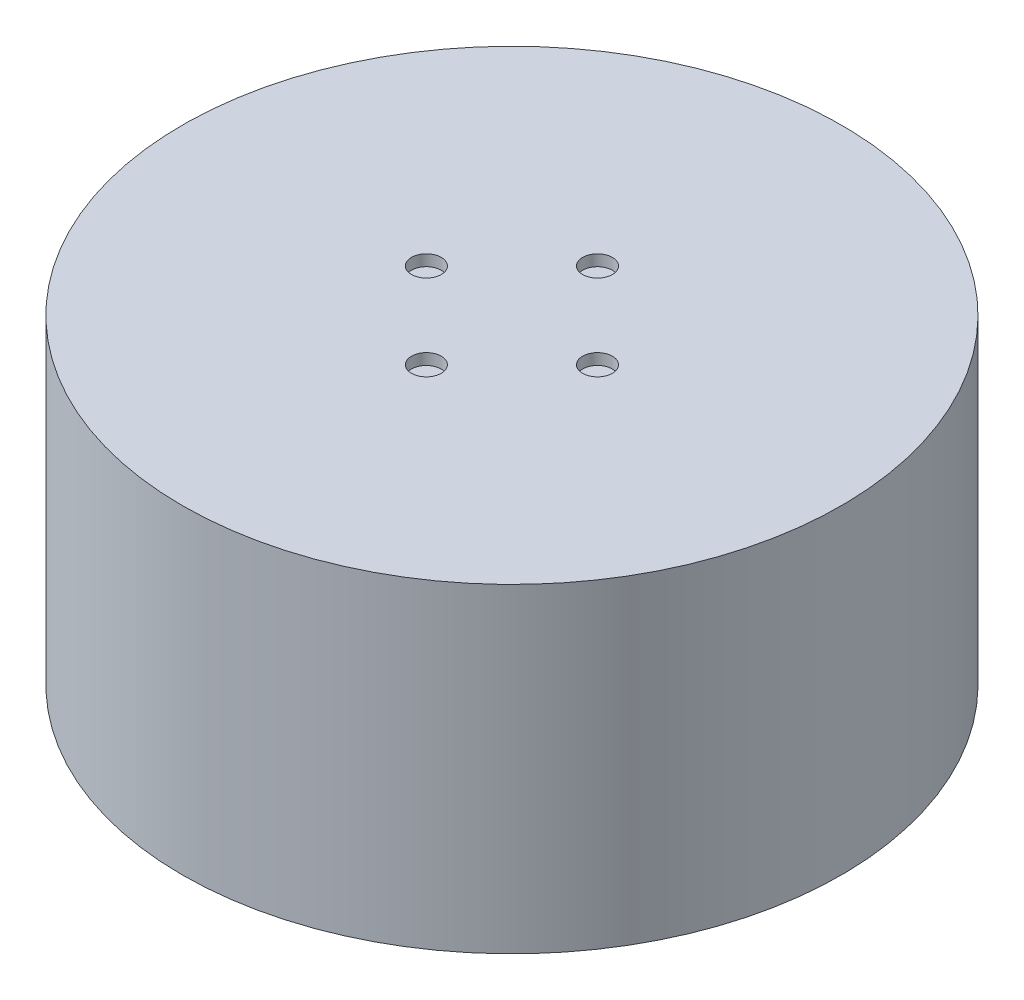
ISO-10303-21;
HEADER;
FILE_DESCRIPTION(('STEP AP214'),'2;1');
FILE_NAME('part.step','',(''),(''),'','','');
FILE_SCHEMA(('AUTOMOTIVE_DESIGN { 1 0 10303 214 1 1 1 1 }'));
ENDSEC;
DATA;
#1=APPLICATION_CONTEXT('core data for automotive mechanical design processes');
#2=APPLICATION_PROTOCOL_DEFINITION('international standard','automotive_design',2000,#1);
#3=PRODUCT_CONTEXT('',#1,'mechanical');
#4=PRODUCT('Part','Part','',(#3));
#5=PRODUCT_RELATED_PRODUCT_CATEGORY('part','',(#4));
#6=PRODUCT_DEFINITION_FORMATION('','',#4);
#7=PRODUCT_DEFINITION_CONTEXT('part definition',#1,'design');
#8=PRODUCT_DEFINITION('design','',#6,#7);
#9=PRODUCT_DEFINITION_SHAPE('','',#8);
#10=(LENGTH_UNIT() NAMED_UNIT(*) SI_UNIT(.MILLI.,.METRE.));
#11=(NAMED_UNIT(*) PLANE_ANGLE_UNIT() SI_UNIT($,.RADIAN.));
#12=(NAMED_UNIT(*) SI_UNIT($,.STERADIAN.) SOLID_ANGLE_UNIT());
#13=UNCERTAINTY_MEASURE_WITH_UNIT(LENGTH_MEASURE(1.E-05),#10,'distance_accuracy_value','');
#14=(GEOMETRIC_REPRESENTATION_CONTEXT(3) GLOBAL_UNCERTAINTY_ASSIGNED_CONTEXT((#13)) GLOBAL_UNIT_ASSIGNED_CONTEXT((#10,
#11,#12)) REPRESENTATION_CONTEXT('',''));
#15=CARTESIAN_POINT('',(0.,0.,0.));
#16=DIRECTION('',(0.,0.,1.));
#17=DIRECTION('',(1.,0.,0.));
#18=AXIS2_PLACEMENT_3D('',#15,#16,#17);
#19=CARTESIAN_POINT('',(0.,0.,0.));
#20=DIRECTION('',(0.,1.,0.));
#21=DIRECTION('',(0.,0.,1.));
#22=AXIS2_PLACEMENT_3D('',#19,#20,#21);
#23=PLANE('',#22);
#24=CARTESIAN_POINT('',(0.,0.,0.));
#25=DIRECTION('',(0.,1.,0.));
#26=DIRECTION('',(0.,0.,1.));
#27=AXIS2_PLACEMENT_3D('',#24,#25,#26);
#28=CIRCLE('',#27,44.3);
#29=CARTESIAN_POINT('',(0.,0.,44.3));
#30=VERTEX_POINT('',#29);
#31=EDGE_CURVE('E43',#30,#30,#28,.T.);
#32=ORIENTED_EDGE('',*,*,#31,.F.);
#33=EDGE_LOOP('',(#32));
#34=FACE_BOUND('',#33,.T.);
#35=CARTESIAN_POINT('',(-16.,0.,0.));
#36=DIRECTION('',(0.,-1.,0.));
#37=DIRECTION('',(0.,0.,-1.));
#38=AXIS2_PLACEMENT_3D('',#35,#36,#37);
#39=CIRCLE('',#38,2.00000000000016);
#40=CARTESIAN_POINT('',(-16.,0.,-2.00000000000017));
#41=VERTEX_POINT('',#40);
#42=EDGE_CURVE('E104',#41,#41,#39,.T.);
#43=ORIENTED_EDGE('',*,*,#42,.F.);
#44=EDGE_LOOP('',(#43));
#45=FACE_BOUND('',#44,.T.);
#46=CARTESIAN_POINT('',(-1.1172740284298E-13,0.,-16.));
#47=DIRECTION('',(0.,-1.,0.));
#48=DIRECTION('',(0.,0.,-1.));
#49=AXIS2_PLACEMENT_3D('',#46,#47,#48);
#50=CIRCLE('',#49,2.);
#51=CARTESIAN_POINT('',(-1.1172740284298E-13,0.,-18.));
#52=VERTEX_POINT('',#51);
#53=EDGE_CURVE('E122',#52,#52,#50,.T.);
#54=ORIENTED_EDGE('',*,*,#53,.F.);
#55=EDGE_LOOP('',(#54));
#56=FACE_BOUND('',#55,.T.);
#57=CARTESIAN_POINT('',(16.,0.,0.));
#58=DIRECTION('',(0.,-1.,0.));
#59=DIRECTION('',(0.,0.,-1.));
#60=AXIS2_PLACEMENT_3D('',#57,#58,#59);
#61=CIRCLE('',#60,2.);
#62=CARTESIAN_POINT('',(16.,0.,-2.00000000000006));
#63=VERTEX_POINT('',#62);
#64=EDGE_CURVE('E116',#63,#63,#61,.T.);
#65=ORIENTED_EDGE('',*,*,#64,.F.);
#66=EDGE_LOOP('',(#65));
#67=FACE_BOUND('',#66,.T.);
#68=CARTESIAN_POINT('',(0.,0.,16.));
#69=DIRECTION('',(0.,-1.,0.));
#70=DIRECTION('',(0.,0.,-1.));
#71=AXIS2_PLACEMENT_3D('',#68,#69,#70);
#72=CIRCLE('',#71,2.);
#73=CARTESIAN_POINT('',(0.,0.,14.));
#74=VERTEX_POINT('',#73);
#75=EDGE_CURVE('E113',#74,#74,#72,.T.);
#76=ORIENTED_EDGE('',*,*,#75,.F.);
#77=EDGE_LOOP('',(#76));
#78=FACE_BOUND('',#77,.T.);
#79=CARTESIAN_POINT('',(17.6776695296637,0.,24.7487373415291));
#80=DIRECTION('',(0.,-1.,0.));
#81=DIRECTION('',(0.,0.,-1.));
#82=AXIS2_PLACEMENT_3D('',#79,#80,#81);
#83=CIRCLE('',#82,3.);
#84=CARTESIAN_POINT('',(19.7989898732234,0.,26.8700576850888));
#85=VERTEX_POINT('',#84);
#86=CARTESIAN_POINT('',(15.5563491861041,0.,22.6274169979695));
#87=VERTEX_POINT('',#86);
#88=EDGE_CURVE('E100',#85,#87,#83,.T.);
#89=ORIENTED_EDGE('',*,*,#88,.F.);
#90=DIRECTION('',(-0.707106781186547,0.,0.707106781186547));
#91=VECTOR('',#90,1.);
#92=CARTESIAN_POINT('',(19.7989898732234,0.,26.8700576850888));
#93=LINE('',#92,#91);
#94=CARTESIAN_POINT('',(26.8700576850888,0.,19.7989898732233));
#95=VERTEX_POINT('',#94);
#96=EDGE_CURVE('E97',#95,#85,#93,.T.);
#97=ORIENTED_EDGE('',*,*,#96,.F.);
#98=CARTESIAN_POINT('',(24.7487373415292,0.,17.6776695296636));
#99=DIRECTION('',(0.,-1.,0.));
#100=DIRECTION('',(0.,0.,-1.));
#101=AXIS2_PLACEMENT_3D('',#98,#99,#100);
#102=CIRCLE('',#101,3.00000000000001);
#103=CARTESIAN_POINT('',(22.6274169979695,0.,15.556349186104));
#104=VERTEX_POINT('',#103);
#105=EDGE_CURVE('E59',#104,#95,#102,.T.);
#106=ORIENTED_EDGE('',*,*,#105,.F.);
#107=DIRECTION('',(0.707106781186547,0.,-0.707106781186548));
#108=VECTOR('',#107,1.);
#109=CARTESIAN_POINT('',(15.5563491861041,0.,22.6274169979695));
#110=LINE('',#109,#108);
#111=EDGE_CURVE('E54',#87,#104,#110,.T.);
#112=ORIENTED_EDGE('',*,*,#111,.F.);
#113=EDGE_LOOP('',(#89,#97,#106,#112));
#114=FACE_BOUND('',#113,.T.);
#115=ADVANCED_FACE('F39',(#34,#45,#56,#67,#78,#114),#23,.F.);
#116=CARTESIAN_POINT('',(0.,43.,0.));
#117=DIRECTION('',(0.,-1.,0.));
#118=DIRECTION('',(0.,0.,-1.));
#119=AXIS2_PLACEMENT_3D('',#116,#117,#118);
#120=CYLINDRICAL_SURFACE('',#119,44.3);
#121=CARTESIAN_POINT('',(0.,43.,0.));
#122=DIRECTION('',(0.,1.,0.));
#123=DIRECTION('',(0.,0.,1.));
#124=AXIS2_PLACEMENT_3D('',#121,#122,#123);
#125=CIRCLE('',#124,44.3);
#126=CARTESIAN_POINT('',(0.,43.,44.3));
#127=VERTEX_POINT('',#126);
#128=EDGE_CURVE('E11',#127,#127,#125,.T.);
#129=ORIENTED_EDGE('',*,*,#128,.F.);
#130=EDGE_LOOP('',(#129));
#131=FACE_BOUND('',#130,.T.);
#132=ORIENTED_EDGE('',*,*,#31,.T.);
#133=EDGE_LOOP('',(#132));
#134=FACE_BOUND('',#133,.T.);
#135=ADVANCED_FACE('F41',(#131,#134),#120,.T.);
#136=CARTESIAN_POINT('',(0.,43.,0.));
#137=DIRECTION('',(0.,1.,0.));
#138=DIRECTION('',(0.,0.,1.));
#139=AXIS2_PLACEMENT_3D('',#136,#137,#138);
#140=PLANE('',#139);
#141=CARTESIAN_POINT('',(0.,43.,-11.5));
#142=DIRECTION('',(0.,1.,0.));
#143=DIRECTION('',(0.,0.,1.));
#144=AXIS2_PLACEMENT_3D('',#141,#142,#143);
#145=CIRCLE('',#144,2.);
#146=CARTESIAN_POINT('',(0.,43.,-9.5));
#147=VERTEX_POINT('',#146);
#148=EDGE_CURVE('E174',#147,#147,#145,.T.);
#149=ORIENTED_EDGE('',*,*,#148,.F.);
#150=EDGE_LOOP('',(#149));
#151=FACE_BOUND('',#150,.T.);
#152=CARTESIAN_POINT('',(11.5,43.,0.));
#153=DIRECTION('',(0.,1.,0.));
#154=DIRECTION('',(0.,0.,1.));
#155=AXIS2_PLACEMENT_3D('',#152,#153,#154);
#156=CIRCLE('',#155,2.);
#157=CARTESIAN_POINT('',(11.5,43.,2.));
#158=VERTEX_POINT('',#157);
#159=EDGE_CURVE('E171',#158,#158,#156,.T.);
#160=ORIENTED_EDGE('',*,*,#159,.F.);
#161=EDGE_LOOP('',(#160));
#162=FACE_BOUND('',#161,.T.);
#163=CARTESIAN_POINT('',(0.,43.,11.5));
#164=DIRECTION('',(0.,1.,0.));
#165=DIRECTION('',(0.,0.,1.));
#166=AXIS2_PLACEMENT_3D('',#163,#164,#165);
#167=CIRCLE('',#166,2.);
#168=CARTESIAN_POINT('',(0.,43.,13.5));
#169=VERTEX_POINT('',#168);
#170=EDGE_CURVE('E165',#169,#169,#167,.T.);
#171=ORIENTED_EDGE('',*,*,#170,.F.);
#172=EDGE_LOOP('',(#171));
#173=FACE_BOUND('',#172,.T.);
#174=CARTESIAN_POINT('',(-11.5,43.,0.));
#175=DIRECTION('',(0.,1.,0.));
#176=DIRECTION('',(0.,0.,1.));
#177=AXIS2_PLACEMENT_3D('',#174,#175,#176);
#178=CIRCLE('',#177,2.);
#179=CARTESIAN_POINT('',(-11.5,43.,2.));
#180=VERTEX_POINT('',#179);
#181=EDGE_CURVE('E159',#180,#180,#178,.T.);
#182=ORIENTED_EDGE('',*,*,#181,.F.);
#183=EDGE_LOOP('',(#182));
#184=FACE_BOUND('',#183,.T.);
#185=ORIENTED_EDGE('',*,*,#128,.T.);
#186=EDGE_LOOP('',(#185));
#187=FACE_BOUND('',#186,.T.);
#188=ADVANCED_FACE('F189',(#151,#162,#173,#184,#187),#140,.T.);
#189=CARTESIAN_POINT('',(-16.,1.5,0.));
#190=DIRECTION('',(0.,-1.,0.));
#191=DIRECTION('',(0.,0.,-1.));
#192=AXIS2_PLACEMENT_3D('',#189,#190,#191);
#193=CYLINDRICAL_SURFACE('',#192,2.00000000000016);
#194=CARTESIAN_POINT('',(-16.,1.5,0.));
#195=DIRECTION('',(0.,-1.,0.));
#196=DIRECTION('',(0.,0.,-1.));
#197=AXIS2_PLACEMENT_3D('',#194,#195,#196);
#198=CIRCLE('',#197,2.00000000000016);
#199=CARTESIAN_POINT('',(-16.,1.5,-2.00000000000017));
#200=VERTEX_POINT('',#199);
#201=EDGE_CURVE('E101',#200,#200,#198,.T.);
#202=ORIENTED_EDGE('',*,*,#201,.F.);
#203=EDGE_LOOP('',(#202));
#204=FACE_BOUND('',#203,.T.);
#205=ORIENTED_EDGE('',*,*,#42,.T.);
#206=EDGE_LOOP('',(#205));
#207=FACE_BOUND('',#206,.T.);
#208=ADVANCED_FACE('F131',(#204,#207),#193,.F.);
#209=CARTESIAN_POINT('',(-16.,1.5,0.));
#210=DIRECTION('',(0.,-1.,0.));
#211=DIRECTION('',(0.,0.,-1.));
#212=AXIS2_PLACEMENT_3D('',#209,#210,#211);
#213=PLANE('',#212);
#214=ORIENTED_EDGE('',*,*,#201,.T.);
#215=EDGE_LOOP('',(#214));
#216=FACE_BOUND('',#215,.T.);
#217=ADVANCED_FACE('F215',(#216),#213,.T.);
#218=CARTESIAN_POINT('',(-1.1172740284298E-13,1.5,-16.));
#219=DIRECTION('',(0.,-1.,0.));
#220=DIRECTION('',(0.,0.,-1.));
#221=AXIS2_PLACEMENT_3D('',#218,#219,#220);
#222=CYLINDRICAL_SURFACE('',#221,2.);
#223=CARTESIAN_POINT('',(-1.1172740284298E-13,1.5,-16.));
#224=DIRECTION('',(0.,-1.,0.));
#225=DIRECTION('',(0.,0.,-1.));
#226=AXIS2_PLACEMENT_3D('',#223,#224,#225);
#227=CIRCLE('',#226,2.);
#228=CARTESIAN_POINT('',(-1.1172740284298E-13,1.5,-18.));
#229=VERTEX_POINT('',#228);
#230=EDGE_CURVE('E125',#229,#229,#227,.T.);
#231=ORIENTED_EDGE('',*,*,#230,.F.);
#232=EDGE_LOOP('',(#231));
#233=FACE_BOUND('',#232,.T.);
#234=ORIENTED_EDGE('',*,*,#53,.T.);
#235=EDGE_LOOP('',(#234));
#236=FACE_BOUND('',#235,.T.);
#237=ADVANCED_FACE('F224',(#233,#236),#222,.F.);
#238=CARTESIAN_POINT('',(-1.1172740284298E-13,1.5,-16.));
#239=DIRECTION('',(0.,-1.,0.));
#240=DIRECTION('',(0.,0.,-1.));
#241=AXIS2_PLACEMENT_3D('',#238,#239,#240);
#242=PLANE('',#241);
#243=ORIENTED_EDGE('',*,*,#230,.T.);
#244=EDGE_LOOP('',(#243));
#245=FACE_BOUND('',#244,.T.);
#246=ADVANCED_FACE('F233',(#245),#242,.T.);
#247=CARTESIAN_POINT('',(16.,1.5,0.));
#248=DIRECTION('',(0.,-1.,0.));
#249=DIRECTION('',(0.,0.,-1.));
#250=AXIS2_PLACEMENT_3D('',#247,#248,#249);
#251=CYLINDRICAL_SURFACE('',#250,2.);
#252=CARTESIAN_POINT('',(16.,1.5,0.));
#253=DIRECTION('',(0.,-1.,0.));
#254=DIRECTION('',(0.,0.,-1.));
#255=AXIS2_PLACEMENT_3D('',#252,#253,#254);
#256=CIRCLE('',#255,2.);
#257=CARTESIAN_POINT('',(16.,1.5,-2.00000000000006));
#258=VERTEX_POINT('',#257);
#259=EDGE_CURVE('E119',#258,#258,#256,.T.);
#260=ORIENTED_EDGE('',*,*,#259,.F.);
#261=EDGE_LOOP('',(#260));
#262=FACE_BOUND('',#261,.T.);
#263=ORIENTED_EDGE('',*,*,#64,.T.);
#264=EDGE_LOOP('',(#263));
#265=FACE_BOUND('',#264,.T.);
#266=ADVANCED_FACE('F242',(#262,#265),#251,.F.);
#267=CARTESIAN_POINT('',(16.,1.5,0.));
#268=DIRECTION('',(0.,-1.,0.));
#269=DIRECTION('',(0.,0.,-1.));
#270=AXIS2_PLACEMENT_3D('',#267,#268,#269);
#271=PLANE('',#270);
#272=ORIENTED_EDGE('',*,*,#259,.T.);
#273=EDGE_LOOP('',(#272));
#274=FACE_BOUND('',#273,.T.);
#275=ADVANCED_FACE('F251',(#274),#271,.T.);
#276=CARTESIAN_POINT('',(0.,1.5,16.));
#277=DIRECTION('',(0.,-1.,0.));
#278=DIRECTION('',(0.,0.,-1.));
#279=AXIS2_PLACEMENT_3D('',#276,#277,#278);
#280=CYLINDRICAL_SURFACE('',#279,2.);
#281=CARTESIAN_POINT('',(0.,1.5,16.));
#282=DIRECTION('',(0.,-1.,0.));
#283=DIRECTION('',(0.,0.,-1.));
#284=AXIS2_PLACEMENT_3D('',#281,#282,#283);
#285=CIRCLE('',#284,2.);
#286=CARTESIAN_POINT('',(0.,1.5,14.));
#287=VERTEX_POINT('',#286);
#288=EDGE_CURVE('E110',#287,#287,#285,.T.);
#289=ORIENTED_EDGE('',*,*,#288,.F.);
#290=EDGE_LOOP('',(#289));
#291=FACE_BOUND('',#290,.T.);
#292=ORIENTED_EDGE('',*,*,#75,.T.);
#293=EDGE_LOOP('',(#292));
#294=FACE_BOUND('',#293,.T.);
#295=ADVANCED_FACE('F260',(#291,#294),#280,.F.);
#296=CARTESIAN_POINT('',(0.,1.5,16.));
#297=DIRECTION('',(0.,-1.,0.));
#298=DIRECTION('',(0.,0.,-1.));
#299=AXIS2_PLACEMENT_3D('',#296,#297,#298);
#300=PLANE('',#299);
#301=ORIENTED_EDGE('',*,*,#288,.T.);
#302=EDGE_LOOP('',(#301));
#303=FACE_BOUND('',#302,.T.);
#304=ADVANCED_FACE('F269',(#303),#300,.T.);
#305=CARTESIAN_POINT('',(17.6776695296637,-6.,24.7487373415291));
#306=DIRECTION('',(0.,1.,0.));
#307=DIRECTION('',(0.,0.,1.));
#308=AXIS2_PLACEMENT_3D('',#305,#306,#307);
#309=CYLINDRICAL_SURFACE('',#308,3.);
#310=ORIENTED_EDGE('',*,*,#88,.T.);
#311=DIRECTION('',(0.,1.,0.));
#312=VECTOR('',#311,1.);
#313=CARTESIAN_POINT('',(15.5563491861041,-6.,22.6274169979695));
#314=LINE('',#313,#312);
#315=CARTESIAN_POINT('',(15.5563491861041,-6.,22.6274169979695));
#316=VERTEX_POINT('',#315);
#317=EDGE_CURVE('E81',#316,#87,#314,.T.);
#318=ORIENTED_EDGE('',*,*,#317,.F.);
#319=CARTESIAN_POINT('',(17.6776695296637,-6.,24.7487373415291));
#320=DIRECTION('',(0.,-1.,0.));
#321=DIRECTION('',(0.,0.,-1.));
#322=AXIS2_PLACEMENT_3D('',#319,#320,#321);
#323=CIRCLE('',#322,3.);
#324=CARTESIAN_POINT('',(19.7989898732234,-6.,26.8700576850888));
#325=VERTEX_POINT('',#324);
#326=EDGE_CURVE('E88',#325,#316,#323,.T.);
#327=ORIENTED_EDGE('',*,*,#326,.F.);
#328=DIRECTION('',(0.,1.,0.));
#329=VECTOR('',#328,1.);
#330=CARTESIAN_POINT('',(19.7989898732234,-6.,26.8700576850888));
#331=LINE('',#330,#329);
#332=EDGE_CURVE('E147',#325,#85,#331,.T.);
#333=ORIENTED_EDGE('',*,*,#332,.T.);
#334=EDGE_LOOP('',(#310,#318,#327,#333));
#335=FACE_BOUND('',#334,.T.);
#336=ADVANCED_FACE('F99',(#335),#309,.T.);
#337=CARTESIAN_POINT('',(15.5563491861041,-6.,22.6274169979695));
#338=DIRECTION('',(0.707106781186548,0.,0.707106781186547));
#339=DIRECTION('',(0.707106781186547,0.,-0.707106781186548));
#340=AXIS2_PLACEMENT_3D('',#337,#338,#339);
#341=PLANE('',#340);
#342=ORIENTED_EDGE('',*,*,#111,.T.);
#343=DIRECTION('',(0.,1.,0.));
#344=VECTOR('',#343,1.);
#345=CARTESIAN_POINT('',(22.6274169979695,-6.,15.556349186104));
#346=LINE('',#345,#344);
#347=CARTESIAN_POINT('',(22.6274169979695,-6.,15.556349186104));
#348=VERTEX_POINT('',#347);
#349=EDGE_CURVE('E84',#348,#104,#346,.T.);
#350=ORIENTED_EDGE('',*,*,#349,.F.);
#351=DIRECTION('',(0.707106781186547,0.,-0.707106781186548));
#352=VECTOR('',#351,1.);
#353=CARTESIAN_POINT('',(15.5563491861041,-6.,22.6274169979695));
#354=LINE('',#353,#352);
#355=EDGE_CURVE('E77',#316,#348,#354,.T.);
#356=ORIENTED_EDGE('',*,*,#355,.F.);
#357=ORIENTED_EDGE('',*,*,#317,.T.);
#358=EDGE_LOOP('',(#342,#350,#356,#357));
#359=FACE_BOUND('',#358,.T.);
#360=ADVANCED_FACE('F79',(#359),#341,.F.);
#361=CARTESIAN_POINT('',(24.7487373415292,-6.,17.6776695296636));
#362=DIRECTION('',(0.,1.,0.));
#363=DIRECTION('',(0.,0.,1.));
#364=AXIS2_PLACEMENT_3D('',#361,#362,#363);
#365=CYLINDRICAL_SURFACE('',#364,3.00000000000001);
#366=ORIENTED_EDGE('',*,*,#105,.T.);
#367=DIRECTION('',(0.,1.,0.));
#368=VECTOR('',#367,1.);
#369=CARTESIAN_POINT('',(26.8700576850888,-6.,19.7989898732233));
#370=LINE('',#369,#368);
#371=CARTESIAN_POINT('',(26.8700576850888,-6.,19.7989898732233));
#372=VERTEX_POINT('',#371);
#373=EDGE_CURVE('E106',#372,#95,#370,.T.);
#374=ORIENTED_EDGE('',*,*,#373,.F.);
#375=CARTESIAN_POINT('',(24.7487373415292,-6.,17.6776695296636));
#376=DIRECTION('',(0.,-1.,0.));
#377=DIRECTION('',(0.,0.,-1.));
#378=AXIS2_PLACEMENT_3D('',#375,#376,#377);
#379=CIRCLE('',#378,3.00000000000001);
#380=EDGE_CURVE('E87',#348,#372,#379,.T.);
#381=ORIENTED_EDGE('',*,*,#380,.F.);
#382=ORIENTED_EDGE('',*,*,#349,.T.);
#383=EDGE_LOOP('',(#366,#374,#381,#382));
#384=FACE_BOUND('',#383,.T.);
#385=ADVANCED_FACE('F297',(#384),#365,.T.);
#386=CARTESIAN_POINT('',(19.7989898732234,-6.,26.8700576850888));
#387=DIRECTION('',(-0.707106781186548,0.,-0.707106781186548));
#388=DIRECTION('',(-0.707106781186548,0.,0.707106781186548));
#389=AXIS2_PLACEMENT_3D('',#386,#387,#388);
#390=PLANE('',#389);
#391=ORIENTED_EDGE('',*,*,#96,.T.);
#392=ORIENTED_EDGE('',*,*,#332,.F.);
#393=DIRECTION('',(-0.707106781186547,0.,0.707106781186547));
#394=VECTOR('',#393,1.);
#395=CARTESIAN_POINT('',(19.7989898732234,-6.,26.8700576850888));
#396=LINE('',#395,#394);
#397=EDGE_CURVE('E93',#372,#325,#396,.T.);
#398=ORIENTED_EDGE('',*,*,#397,.F.);
#399=ORIENTED_EDGE('',*,*,#373,.T.);
#400=EDGE_LOOP('',(#391,#392,#398,#399));
#401=FACE_BOUND('',#400,.T.);
#402=ADVANCED_FACE('F146',(#401),#390,.F.);
#403=CARTESIAN_POINT('',(17.6776695296637,-6.,24.7487373415291));
#404=DIRECTION('',(0.,-1.,0.));
#405=DIRECTION('',(0.,0.,-1.));
#406=AXIS2_PLACEMENT_3D('',#403,#404,#405);
#407=PLANE('',#406);
#408=ORIENTED_EDGE('',*,*,#326,.T.);
#409=ORIENTED_EDGE('',*,*,#355,.T.);
#410=ORIENTED_EDGE('',*,*,#380,.T.);
#411=ORIENTED_EDGE('',*,*,#397,.T.);
#412=EDGE_LOOP('',(#408,#409,#410,#411));
#413=FACE_BOUND('',#412,.T.);
#414=ADVANCED_FACE('F91',(#413),#407,.T.);
#415=CARTESIAN_POINT('',(-11.5,41.5,0.));
#416=DIRECTION('',(0.,1.,0.));
#417=DIRECTION('',(0.,0.,1.));
#418=AXIS2_PLACEMENT_3D('',#415,#416,#417);
#419=CYLINDRICAL_SURFACE('',#418,2.);
#420=CARTESIAN_POINT('',(-11.5,41.5,0.));
#421=DIRECTION('',(0.,1.,0.));
#422=DIRECTION('',(0.,0.,1.));
#423=AXIS2_PLACEMENT_3D('',#420,#421,#422);
#424=CIRCLE('',#423,2.);
#425=CARTESIAN_POINT('',(-11.5,41.5,2.));
#426=VERTEX_POINT('',#425);
#427=EDGE_CURVE('E156',#426,#426,#424,.T.);
#428=ORIENTED_EDGE('',*,*,#427,.F.);
#429=EDGE_LOOP('',(#428));
#430=FACE_BOUND('',#429,.T.);
#431=ORIENTED_EDGE('',*,*,#181,.T.);
#432=EDGE_LOOP('',(#431));
#433=FACE_BOUND('',#432,.T.);
#434=ADVANCED_FACE('F319',(#430,#433),#419,.F.);
#435=CARTESIAN_POINT('',(-11.5,41.5,0.));
#436=DIRECTION('',(0.,1.,0.));
#437=DIRECTION('',(0.,0.,1.));
#438=AXIS2_PLACEMENT_3D('',#435,#436,#437);
#439=PLANE('',#438);
#440=ORIENTED_EDGE('',*,*,#427,.T.);
#441=EDGE_LOOP('',(#440));
#442=FACE_BOUND('',#441,.T.);
#443=ADVANCED_FACE('F332',(#442),#439,.T.);
#444=CARTESIAN_POINT('',(0.,41.5,11.5));
#445=DIRECTION('',(0.,1.,0.));
#446=DIRECTION('',(0.,0.,1.));
#447=AXIS2_PLACEMENT_3D('',#444,#445,#446);
#448=CYLINDRICAL_SURFACE('',#447,2.);
#449=CARTESIAN_POINT('',(0.,41.5,11.5));
#450=DIRECTION('',(0.,1.,0.));
#451=DIRECTION('',(0.,0.,1.));
#452=AXIS2_PLACEMENT_3D('',#449,#450,#451);
#453=CIRCLE('',#452,2.);
#454=CARTESIAN_POINT('',(0.,41.5,13.5));
#455=VERTEX_POINT('',#454);
#456=EDGE_CURVE('E162',#455,#455,#453,.T.);
#457=ORIENTED_EDGE('',*,*,#456,.F.);
#458=EDGE_LOOP('',(#457));
#459=FACE_BOUND('',#458,.T.);
#460=ORIENTED_EDGE('',*,*,#170,.T.);
#461=EDGE_LOOP('',(#460));
#462=FACE_BOUND('',#461,.T.);
#463=ADVANCED_FACE('F341',(#459,#462),#448,.F.);
#464=CARTESIAN_POINT('',(0.,41.5,11.5));
#465=DIRECTION('',(0.,1.,0.));
#466=DIRECTION('',(0.,0.,1.));
#467=AXIS2_PLACEMENT_3D('',#464,#465,#466);
#468=PLANE('',#467);
#469=ORIENTED_EDGE('',*,*,#456,.T.);
#470=EDGE_LOOP('',(#469));
#471=FACE_BOUND('',#470,.T.);
#472=ADVANCED_FACE('F350',(#471),#468,.T.);
#473=CARTESIAN_POINT('',(11.5,41.5,0.));
#474=DIRECTION('',(0.,1.,0.));
#475=DIRECTION('',(0.,0.,1.));
#476=AXIS2_PLACEMENT_3D('',#473,#474,#475);
#477=CYLINDRICAL_SURFACE('',#476,2.);
#478=CARTESIAN_POINT('',(11.5,41.5,0.));
#479=DIRECTION('',(0.,1.,0.));
#480=DIRECTION('',(0.,0.,1.));
#481=AXIS2_PLACEMENT_3D('',#478,#479,#480);
#482=CIRCLE('',#481,2.);
#483=CARTESIAN_POINT('',(11.5,41.5,2.));
#484=VERTEX_POINT('',#483);
#485=EDGE_CURVE('E168',#484,#484,#482,.T.);
#486=ORIENTED_EDGE('',*,*,#485,.F.);
#487=EDGE_LOOP('',(#486));
#488=FACE_BOUND('',#487,.T.);
#489=ORIENTED_EDGE('',*,*,#159,.T.);
#490=EDGE_LOOP('',(#489));
#491=FACE_BOUND('',#490,.T.);
#492=ADVANCED_FACE('F359',(#488,#491),#477,.F.);
#493=CARTESIAN_POINT('',(11.5,41.5,0.));
#494=DIRECTION('',(0.,1.,0.));
#495=DIRECTION('',(0.,0.,1.));
#496=AXIS2_PLACEMENT_3D('',#493,#494,#495);
#497=PLANE('',#496);
#498=ORIENTED_EDGE('',*,*,#485,.T.);
#499=EDGE_LOOP('',(#498));
#500=FACE_BOUND('',#499,.T.);
#501=ADVANCED_FACE('F185',(#500),#497,.T.);
#502=CARTESIAN_POINT('',(0.,41.5,-11.5));
#503=DIRECTION('',(0.,1.,0.));
#504=DIRECTION('',(0.,0.,1.));
#505=AXIS2_PLACEMENT_3D('',#502,#503,#504);
#506=CYLINDRICAL_SURFACE('',#505,2.);
#507=CARTESIAN_POINT('',(0.,41.5,-11.5));
#508=DIRECTION('',(0.,1.,0.));
#509=DIRECTION('',(0.,0.,1.));
#510=AXIS2_PLACEMENT_3D('',#507,#508,#509);
#511=CIRCLE('',#510,2.);
#512=CARTESIAN_POINT('',(0.,41.5,-9.5));
#513=VERTEX_POINT('',#512);
#514=EDGE_CURVE('E142',#513,#513,#511,.T.);
#515=ORIENTED_EDGE('',*,*,#514,.F.);
#516=EDGE_LOOP('',(#515));
#517=FACE_BOUND('',#516,.T.);
#518=ORIENTED_EDGE('',*,*,#148,.T.);
#519=EDGE_LOOP('',(#518));
#520=FACE_BOUND('',#519,.T.);
#521=ADVANCED_FACE('F182',(#517,#520),#506,.F.);
#522=CARTESIAN_POINT('',(0.,41.5,-11.5));
#523=DIRECTION('',(0.,1.,0.));
#524=DIRECTION('',(0.,0.,1.));
#525=AXIS2_PLACEMENT_3D('',#522,#523,#524);
#526=PLANE('',#525);
#527=ORIENTED_EDGE('',*,*,#514,.T.);
#528=EDGE_LOOP('',(#527));
#529=FACE_BOUND('',#528,.T.);
#530=ADVANCED_FACE('F180',(#529),#526,.T.);
#531=CLOSED_SHELL('',(#115,#135,#188,#208,#217,#237,#246,#266,#275,#295,#304,#336,#360,#385,
#402,#414,#434,#443,#463,#472,#492,#501,#521,#530));
#532=MANIFOLD_SOLID_BREP('B2',#531);
#533=ADVANCED_BREP_SHAPE_REPRESENTATION('',(#18,#532),#14);
#534=SHAPE_DEFINITION_REPRESENTATION(#9,#533);
ENDSEC;
END-ISO-10303-21;
